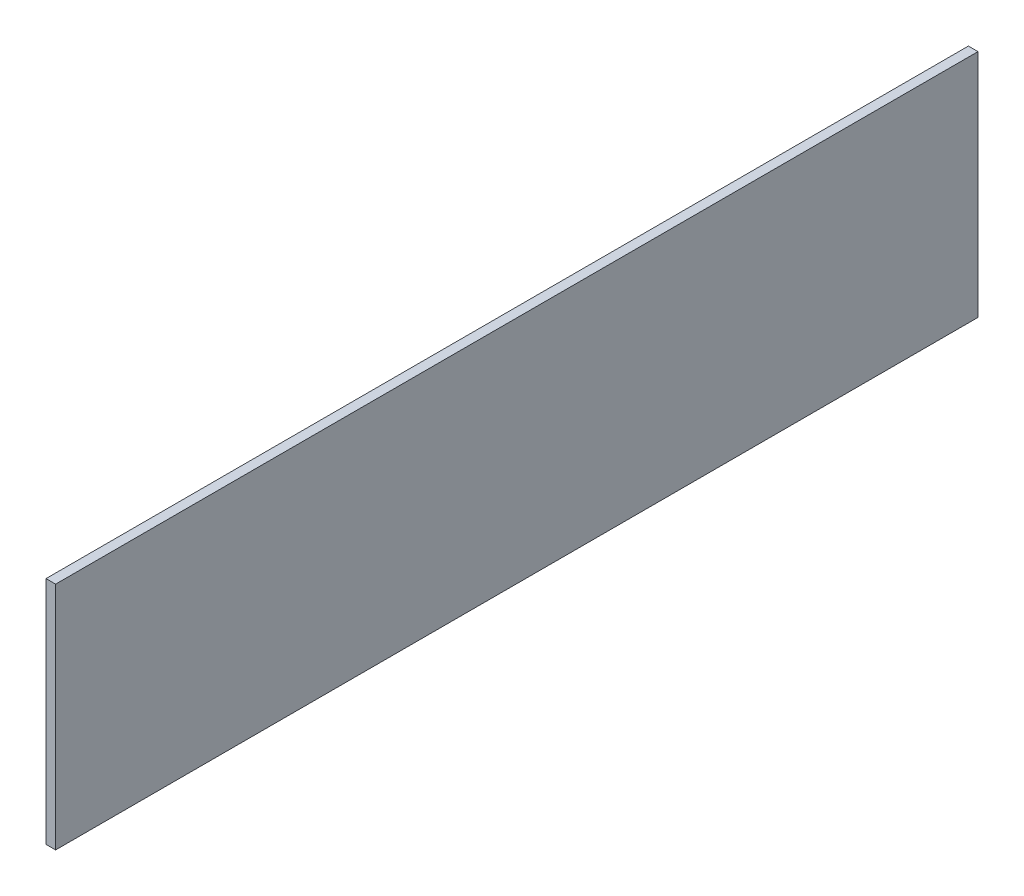
ISO-10303-21;
HEADER;
FILE_DESCRIPTION(('STEP AP214'),'2;1');
FILE_NAME('part.step','',(''),(''),'','','');
FILE_SCHEMA(('AUTOMOTIVE_DESIGN { 1 0 10303 214 1 1 1 1 }'));
ENDSEC;
DATA;
#1=APPLICATION_CONTEXT('core data for automotive mechanical design processes');
#2=APPLICATION_PROTOCOL_DEFINITION('international standard','automotive_design',2000,#1);
#3=PRODUCT_CONTEXT('',#1,'mechanical');
#4=PRODUCT('Part','Part','',(#3));
#5=PRODUCT_RELATED_PRODUCT_CATEGORY('part','',(#4));
#6=PRODUCT_DEFINITION_FORMATION('','',#4);
#7=PRODUCT_DEFINITION_CONTEXT('part definition',#1,'design');
#8=PRODUCT_DEFINITION('design','',#6,#7);
#9=PRODUCT_DEFINITION_SHAPE('','',#8);
#10=(LENGTH_UNIT() NAMED_UNIT(*) SI_UNIT(.MILLI.,.METRE.));
#11=(NAMED_UNIT(*) PLANE_ANGLE_UNIT() SI_UNIT($,.RADIAN.));
#12=(NAMED_UNIT(*) SI_UNIT($,.STERADIAN.) SOLID_ANGLE_UNIT());
#13=UNCERTAINTY_MEASURE_WITH_UNIT(LENGTH_MEASURE(1.E-05),#10,'distance_accuracy_value','');
#14=(GEOMETRIC_REPRESENTATION_CONTEXT(3) GLOBAL_UNCERTAINTY_ASSIGNED_CONTEXT((#13)) GLOBAL_UNIT_ASSIGNED_CONTEXT((#10,
#11,#12)) REPRESENTATION_CONTEXT('',''));
#15=CARTESIAN_POINT('',(0.,0.,0.));
#16=DIRECTION('',(0.,0.,1.));
#17=DIRECTION('',(1.,0.,0.));
#18=AXIS2_PLACEMENT_3D('',#15,#16,#17);
#19=CARTESIAN_POINT('',(3.175,0.,0.));
#20=DIRECTION('',(0.,0.,-1.));
#21=DIRECTION('',(0.,1.,0.));
#22=AXIS2_PLACEMENT_3D('',#19,#20,#21);
#23=PLANE('',#22);
#24=DIRECTION('',(0.,-1.,0.));
#25=VECTOR('',#24,1.);
#26=CARTESIAN_POINT('',(0.,0.,0.));
#27=LINE('',#26,#25);
#28=CARTESIAN_POINT('',(0.,0.,0.));
#29=VERTEX_POINT('',#28);
#30=CARTESIAN_POINT('',(0.,-76.073,0.));
#31=VERTEX_POINT('',#30);
#32=EDGE_CURVE('E96',#29,#31,#27,.T.);
#33=ORIENTED_EDGE('',*,*,#32,.T.);
#34=DIRECTION('',(-1.,0.,0.));
#35=VECTOR('',#34,1.);
#36=CARTESIAN_POINT('',(3.175,-76.073,0.));
#37=LINE('',#36,#35);
#38=CARTESIAN_POINT('',(3.175,-76.073,0.));
#39=VERTEX_POINT('',#38);
#40=EDGE_CURVE('E11',#39,#31,#37,.T.);
#41=ORIENTED_EDGE('',*,*,#40,.F.);
#42=DIRECTION('',(0.,-1.,0.));
#43=VECTOR('',#42,1.);
#44=CARTESIAN_POINT('',(3.175,0.,0.));
#45=LINE('',#44,#43);
#46=CARTESIAN_POINT('',(3.175,0.,0.));
#47=VERTEX_POINT('',#46);
#48=EDGE_CURVE('E84',#47,#39,#45,.T.);
#49=ORIENTED_EDGE('',*,*,#48,.F.);
#50=DIRECTION('',(-1.,0.,0.));
#51=VECTOR('',#50,1.);
#52=CARTESIAN_POINT('',(3.175,0.,0.));
#53=LINE('',#52,#51);
#54=EDGE_CURVE('E92',#47,#29,#53,.T.);
#55=ORIENTED_EDGE('',*,*,#54,.T.);
#56=EDGE_LOOP('',(#33,#41,#49,#55));
#57=FACE_BOUND('',#56,.T.);
#58=ADVANCED_FACE('F33',(#57),#23,.F.);
#59=CARTESIAN_POINT('',(3.175,-76.073,0.));
#60=DIRECTION('',(0.,1.,0.));
#61=DIRECTION('',(0.,0.,1.));
#62=AXIS2_PLACEMENT_3D('',#59,#60,#61);
#63=PLANE('',#62);
#64=DIRECTION('',(0.,0.,-1.));
#65=VECTOR('',#64,1.);
#66=CARTESIAN_POINT('',(0.,-76.073,0.));
#67=LINE('',#66,#65);
#68=CARTESIAN_POINT('',(0.,-76.073,-304.8));
#69=VERTEX_POINT('',#68);
#70=EDGE_CURVE('E88',#31,#69,#67,.T.);
#71=ORIENTED_EDGE('',*,*,#70,.T.);
#72=DIRECTION('',(-1.,0.,0.));
#73=VECTOR('',#72,1.);
#74=CARTESIAN_POINT('',(3.175,-76.073,-304.8));
#75=LINE('',#74,#73);
#76=CARTESIAN_POINT('',(3.175,-76.073,-304.8));
#77=VERTEX_POINT('',#76);
#78=EDGE_CURVE('E41',#77,#69,#75,.T.);
#79=ORIENTED_EDGE('',*,*,#78,.F.);
#80=DIRECTION('',(0.,0.,-1.));
#81=VECTOR('',#80,1.);
#82=CARTESIAN_POINT('',(3.175,-76.073,0.));
#83=LINE('',#82,#81);
#84=EDGE_CURVE('E79',#39,#77,#83,.T.);
#85=ORIENTED_EDGE('',*,*,#84,.F.);
#86=ORIENTED_EDGE('',*,*,#40,.T.);
#87=EDGE_LOOP('',(#71,#79,#85,#86));
#88=FACE_BOUND('',#87,.T.);
#89=ADVANCED_FACE('F87',(#88),#63,.F.);
#90=CARTESIAN_POINT('',(3.175,0.,-304.8));
#91=DIRECTION('',(0.,0.,1.));
#92=DIRECTION('',(1.,0.,0.));
#93=AXIS2_PLACEMENT_3D('',#90,#91,#92);
#94=PLANE('',#93);
#95=DIRECTION('',(0.,1.,0.));
#96=VECTOR('',#95,1.);
#97=CARTESIAN_POINT('',(0.,0.,-304.8));
#98=LINE('',#97,#96);
#99=CARTESIAN_POINT('',(0.,0.,-304.8));
#100=VERTEX_POINT('',#99);
#101=EDGE_CURVE('E66',#69,#100,#98,.T.);
#102=ORIENTED_EDGE('',*,*,#101,.T.);
#103=DIRECTION('',(-1.,0.,0.));
#104=VECTOR('',#103,1.);
#105=CARTESIAN_POINT('',(3.175,0.,-304.8));
#106=LINE('',#105,#104);
#107=CARTESIAN_POINT('',(3.175,0.,-304.8));
#108=VERTEX_POINT('',#107);
#109=EDGE_CURVE('E89',#108,#100,#106,.T.);
#110=ORIENTED_EDGE('',*,*,#109,.F.);
#111=DIRECTION('',(0.,1.,0.));
#112=VECTOR('',#111,1.);
#113=CARTESIAN_POINT('',(3.175,0.,-304.8));
#114=LINE('',#113,#112);
#115=EDGE_CURVE('E82',#77,#108,#114,.T.);
#116=ORIENTED_EDGE('',*,*,#115,.F.);
#117=ORIENTED_EDGE('',*,*,#78,.T.);
#118=EDGE_LOOP('',(#102,#110,#116,#117));
#119=FACE_BOUND('',#118,.T.);
#120=ADVANCED_FACE('F90',(#119),#94,.F.);
#121=CARTESIAN_POINT('',(3.175,0.,0.));
#122=DIRECTION('',(0.,-1.,0.));
#123=DIRECTION('',(0.,0.,-1.));
#124=AXIS2_PLACEMENT_3D('',#121,#122,#123);
#125=PLANE('',#124);
#126=DIRECTION('',(0.,0.,1.));
#127=VECTOR('',#126,1.);
#128=CARTESIAN_POINT('',(0.,0.,0.));
#129=LINE('',#128,#127);
#130=EDGE_CURVE('E72',#100,#29,#129,.T.);
#131=ORIENTED_EDGE('',*,*,#130,.T.);
#132=ORIENTED_EDGE('',*,*,#54,.F.);
#133=DIRECTION('',(0.,0.,1.));
#134=VECTOR('',#133,1.);
#135=CARTESIAN_POINT('',(3.175,0.,0.));
#136=LINE('',#135,#134);
#137=EDGE_CURVE('E49',#108,#47,#136,.T.);
#138=ORIENTED_EDGE('',*,*,#137,.F.);
#139=ORIENTED_EDGE('',*,*,#109,.T.);
#140=EDGE_LOOP('',(#131,#132,#138,#139));
#141=FACE_BOUND('',#140,.T.);
#142=ADVANCED_FACE('F103',(#141),#125,.F.);
#143=CARTESIAN_POINT('',(3.175,0.,0.));
#144=DIRECTION('',(1.,0.,0.));
#145=DIRECTION('',(0.,0.,-1.));
#146=AXIS2_PLACEMENT_3D('',#143,#144,#145);
#147=PLANE('',#146);
#148=ORIENTED_EDGE('',*,*,#48,.T.);
#149=ORIENTED_EDGE('',*,*,#84,.T.);
#150=ORIENTED_EDGE('',*,*,#115,.T.);
#151=ORIENTED_EDGE('',*,*,#137,.T.);
#152=EDGE_LOOP('',(#148,#149,#150,#151));
#153=FACE_BOUND('',#152,.T.);
#154=ADVANCED_FACE('F80',(#153),#147,.T.);
#155=CARTESIAN_POINT('',(0.,0.,0.));
#156=DIRECTION('',(1.,0.,0.));
#157=DIRECTION('',(0.,0.,-1.));
#158=AXIS2_PLACEMENT_3D('',#155,#156,#157);
#159=PLANE('',#158);
#160=ORIENTED_EDGE('',*,*,#32,.F.);
#161=ORIENTED_EDGE('',*,*,#130,.F.);
#162=ORIENTED_EDGE('',*,*,#101,.F.);
#163=ORIENTED_EDGE('',*,*,#70,.F.);
#164=EDGE_LOOP('',(#160,#161,#162,#163));
#165=FACE_BOUND('',#164,.T.);
#166=ADVANCED_FACE('F106',(#165),#159,.F.);
#167=CLOSED_SHELL('',(#58,#89,#120,#142,#154,#166));
#168=MANIFOLD_SOLID_BREP('B2',#167);
#169=ADVANCED_BREP_SHAPE_REPRESENTATION('',(#18,#168),#14);
#170=SHAPE_DEFINITION_REPRESENTATION(#9,#169);
ENDSEC;
END-ISO-10303-21;
